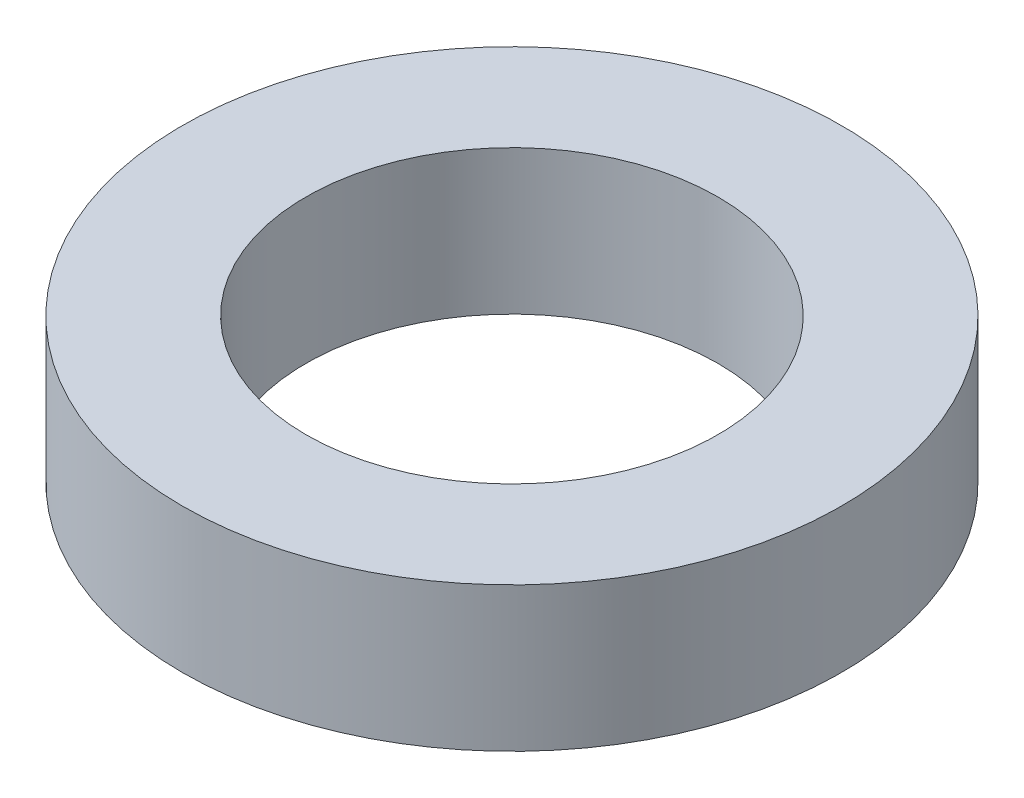
ISO-10303-21;
HEADER;
FILE_DESCRIPTION(('STEP AP214'),'2;1');
FILE_NAME('part.step','',(''),(''),'','','');
FILE_SCHEMA(('AUTOMOTIVE_DESIGN { 1 0 10303 214 1 1 1 1 }'));
ENDSEC;
DATA;
#1=APPLICATION_CONTEXT('core data for automotive mechanical design processes');
#2=APPLICATION_PROTOCOL_DEFINITION('international standard','automotive_design',2000,#1);
#3=PRODUCT_CONTEXT('',#1,'mechanical');
#4=PRODUCT('Part','Part','',(#3));
#5=PRODUCT_RELATED_PRODUCT_CATEGORY('part','',(#4));
#6=PRODUCT_DEFINITION_FORMATION('','',#4);
#7=PRODUCT_DEFINITION_CONTEXT('part definition',#1,'design');
#8=PRODUCT_DEFINITION('design','',#6,#7);
#9=PRODUCT_DEFINITION_SHAPE('','',#8);
#10=(LENGTH_UNIT() NAMED_UNIT(*) SI_UNIT(.MILLI.,.METRE.));
#11=(NAMED_UNIT(*) PLANE_ANGLE_UNIT() SI_UNIT($,.RADIAN.));
#12=(NAMED_UNIT(*) SI_UNIT($,.STERADIAN.) SOLID_ANGLE_UNIT());
#13=UNCERTAINTY_MEASURE_WITH_UNIT(LENGTH_MEASURE(1.E-05),#10,'distance_accuracy_value','');
#14=(GEOMETRIC_REPRESENTATION_CONTEXT(3) GLOBAL_UNCERTAINTY_ASSIGNED_CONTEXT((#13)) GLOBAL_UNIT_ASSIGNED_CONTEXT((#10,
#11,#12)) REPRESENTATION_CONTEXT('',''));
#15=CARTESIAN_POINT('',(0.,0.,0.));
#16=DIRECTION('',(0.,0.,1.));
#17=DIRECTION('',(1.,0.,0.));
#18=AXIS2_PLACEMENT_3D('',#15,#16,#17);
#19=CARTESIAN_POINT('',(0.,7.,0.));
#20=DIRECTION('',(0.,1.,0.));
#21=DIRECTION('',(0.,0.,1.));
#22=AXIS2_PLACEMENT_3D('',#19,#20,#21);
#23=PLANE('',#22);
#24=CARTESIAN_POINT('',(0.,7.,0.));
#25=DIRECTION('',(0.,1.,0.));
#26=DIRECTION('',(0.,0.,1.));
#27=AXIS2_PLACEMENT_3D('',#24,#25,#26);
#28=CIRCLE('',#27,16.);
#29=CARTESIAN_POINT('',(0.,7.,16.));
#30=VERTEX_POINT('',#29);
#31=EDGE_CURVE('E10',#30,#30,#28,.T.);
#32=ORIENTED_EDGE('',*,*,#31,.T.);
#33=EDGE_LOOP('',(#32));
#34=FACE_BOUND('',#33,.T.);
#35=CARTESIAN_POINT('',(0.,7.,0.));
#36=DIRECTION('',(0.,1.,0.));
#37=DIRECTION('',(0.,0.,1.));
#38=AXIS2_PLACEMENT_3D('',#35,#36,#37);
#39=CIRCLE('',#38,10.);
#40=CARTESIAN_POINT('',(0.,7.,10.));
#41=VERTEX_POINT('',#40);
#42=EDGE_CURVE('E56',#41,#41,#39,.T.);
#43=ORIENTED_EDGE('',*,*,#42,.F.);
#44=EDGE_LOOP('',(#43));
#45=FACE_BOUND('',#44,.T.);
#46=ADVANCED_FACE('F43',(#34,#45),#23,.T.);
#47=CARTESIAN_POINT('',(0.,0.,0.));
#48=DIRECTION('',(0.,1.,0.));
#49=DIRECTION('',(0.,0.,1.));
#50=AXIS2_PLACEMENT_3D('',#47,#48,#49);
#51=PLANE('',#50);
#52=CARTESIAN_POINT('',(0.,0.,0.));
#53=DIRECTION('',(0.,1.,0.));
#54=DIRECTION('',(0.,0.,1.));
#55=AXIS2_PLACEMENT_3D('',#52,#53,#54);
#56=CIRCLE('',#55,16.);
#57=CARTESIAN_POINT('',(0.,0.,16.));
#58=VERTEX_POINT('',#57);
#59=EDGE_CURVE('E47',#58,#58,#56,.T.);
#60=ORIENTED_EDGE('',*,*,#59,.F.);
#61=EDGE_LOOP('',(#60));
#62=FACE_BOUND('',#61,.T.);
#63=CARTESIAN_POINT('',(0.,0.,0.));
#64=DIRECTION('',(0.,1.,0.));
#65=DIRECTION('',(0.,0.,1.));
#66=AXIS2_PLACEMENT_3D('',#63,#64,#65);
#67=CIRCLE('',#66,10.);
#68=CARTESIAN_POINT('',(0.,0.,10.));
#69=VERTEX_POINT('',#68);
#70=EDGE_CURVE('E58',#69,#69,#67,.T.);
#71=ORIENTED_EDGE('',*,*,#70,.T.);
#72=EDGE_LOOP('',(#71));
#73=FACE_BOUND('',#72,.T.);
#74=ADVANCED_FACE('F70',(#62,#73),#51,.F.);
#75=CARTESIAN_POINT('',(0.,7.,0.));
#76=DIRECTION('',(0.,-1.,0.));
#77=DIRECTION('',(0.,0.,-1.));
#78=AXIS2_PLACEMENT_3D('',#75,#76,#77);
#79=CYLINDRICAL_SURFACE('',#78,16.);
#80=ORIENTED_EDGE('',*,*,#31,.F.);
#81=EDGE_LOOP('',(#80));
#82=FACE_BOUND('',#81,.T.);
#83=ORIENTED_EDGE('',*,*,#59,.T.);
#84=EDGE_LOOP('',(#83));
#85=FACE_BOUND('',#84,.T.);
#86=ADVANCED_FACE('F45',(#82,#85),#79,.T.);
#87=CARTESIAN_POINT('',(0.,7.,0.));
#88=DIRECTION('',(0.,-1.,0.));
#89=DIRECTION('',(0.,0.,-1.));
#90=AXIS2_PLACEMENT_3D('',#87,#88,#89);
#91=CYLINDRICAL_SURFACE('',#90,10.);
#92=ORIENTED_EDGE('',*,*,#42,.T.);
#93=EDGE_LOOP('',(#92));
#94=FACE_BOUND('',#93,.T.);
#95=ORIENTED_EDGE('',*,*,#70,.F.);
#96=EDGE_LOOP('',(#95));
#97=FACE_BOUND('',#96,.T.);
#98=ADVANCED_FACE('F66',(#94,#97),#91,.F.);
#99=CLOSED_SHELL('',(#46,#74,#86,#98));
#100=MANIFOLD_SOLID_BREP('B2',#99);
#101=ADVANCED_BREP_SHAPE_REPRESENTATION('',(#18,#100),#14);
#102=SHAPE_DEFINITION_REPRESENTATION(#9,#101);
ENDSEC;
END-ISO-10303-21;
